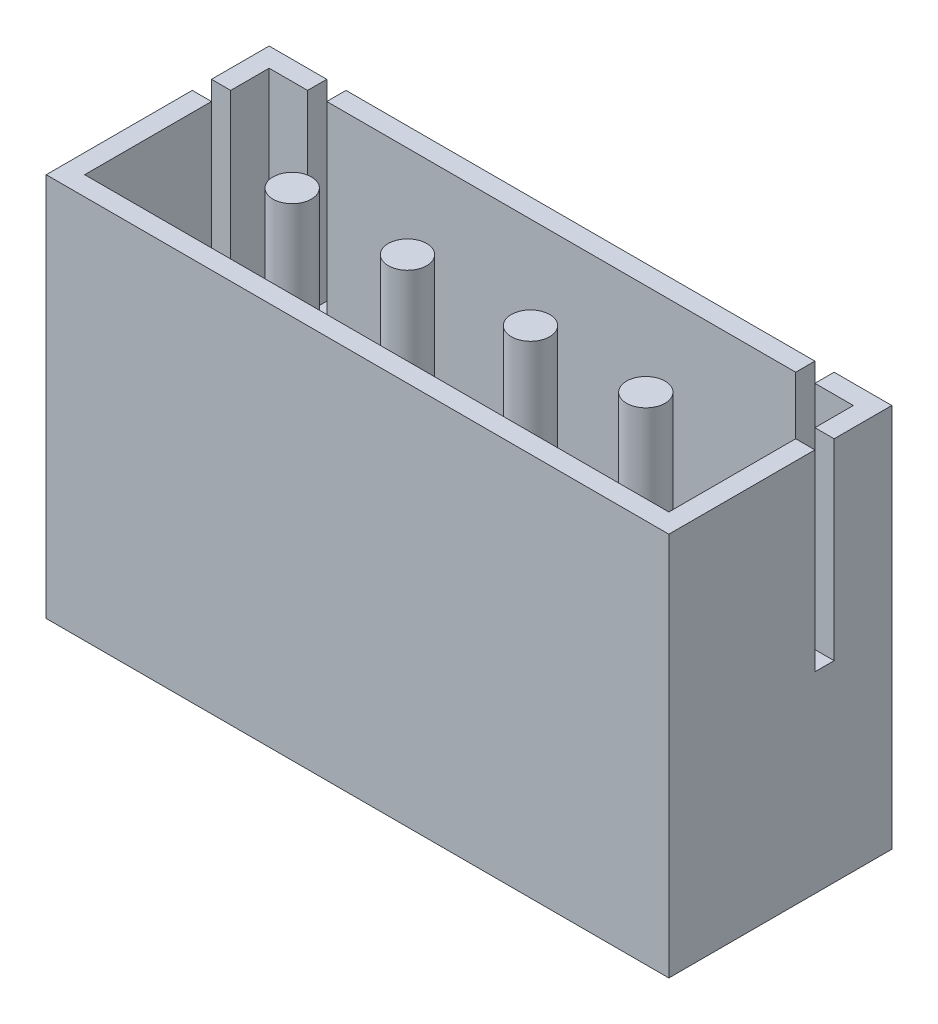
ISO-10303-21;
HEADER;
FILE_DESCRIPTION(('STEP AP214'),'2;1');
FILE_NAME('part.step','',(''),(''),'','','');
FILE_SCHEMA(('AUTOMOTIVE_DESIGN { 1 0 10303 214 1 1 1 1 }'));
ENDSEC;
DATA;
#1=APPLICATION_CONTEXT('core data for automotive mechanical design processes');
#2=APPLICATION_PROTOCOL_DEFINITION('international standard','automotive_design',2000,#1);
#3=PRODUCT_CONTEXT('',#1,'mechanical');
#4=PRODUCT('Part','Part','',(#3));
#5=PRODUCT_RELATED_PRODUCT_CATEGORY('part','',(#4));
#6=PRODUCT_DEFINITION_FORMATION('','',#4);
#7=PRODUCT_DEFINITION_CONTEXT('part definition',#1,'design');
#8=PRODUCT_DEFINITION('design','',#6,#7);
#9=PRODUCT_DEFINITION_SHAPE('','',#8);
#10=(LENGTH_UNIT() NAMED_UNIT(*) SI_UNIT(.MILLI.,.METRE.));
#11=(NAMED_UNIT(*) PLANE_ANGLE_UNIT() SI_UNIT($,.RADIAN.));
#12=(NAMED_UNIT(*) SI_UNIT($,.STERADIAN.) SOLID_ANGLE_UNIT());
#13=UNCERTAINTY_MEASURE_WITH_UNIT(LENGTH_MEASURE(1.E-05),#10,'distance_accuracy_value','');
#14=(GEOMETRIC_REPRESENTATION_CONTEXT(3) GLOBAL_UNCERTAINTY_ASSIGNED_CONTEXT((#13)) GLOBAL_UNIT_ASSIGNED_CONTEXT((#10,
#11,#12)) REPRESENTATION_CONTEXT('',''));
#15=CARTESIAN_POINT('',(0.,0.,0.));
#16=DIRECTION('',(0.,0.,1.));
#17=DIRECTION('',(1.,0.,0.));
#18=AXIS2_PLACEMENT_3D('',#15,#16,#17);
#19=CARTESIAN_POINT('',(8.1,10.,2.9));
#20=DIRECTION('',(-1.,0.,0.));
#21=DIRECTION('',(0.,0.,1.));
#22=AXIS2_PLACEMENT_3D('',#19,#20,#21);
#23=PLANE('',#22);
#24=DIRECTION('',(0.,1.,0.));
#25=VECTOR('',#24,1.);
#26=CARTESIAN_POINT('',(8.1,5.,-0.900000000000001));
#27=LINE('',#26,#25);
#28=CARTESIAN_POINT('',(8.1,5.,-0.900000000000001));
#29=VERTEX_POINT('',#28);
#30=CARTESIAN_POINT('',(8.1,10.,-0.900000000000001));
#31=VERTEX_POINT('',#30);
#32=EDGE_CURVE('E262',#29,#31,#27,.T.);
#33=ORIENTED_EDGE('',*,*,#32,.T.);
#34=DIRECTION('',(0.,0.,-1.));
#35=VECTOR('',#34,1.);
#36=CARTESIAN_POINT('',(8.1,10.,2.9));
#37=LINE('',#36,#35);
#38=CARTESIAN_POINT('',(8.1,10.,2.9));
#39=VERTEX_POINT('',#38);
#40=EDGE_CURVE('E436',#39,#31,#37,.T.);
#41=ORIENTED_EDGE('',*,*,#40,.F.);
#42=DIRECTION('',(0.,-1.,0.));
#43=VECTOR('',#42,1.);
#44=CARTESIAN_POINT('',(8.1,10.,2.9));
#45=LINE('',#44,#43);
#46=CARTESIAN_POINT('',(8.1,0.,2.9));
#47=VERTEX_POINT('',#46);
#48=EDGE_CURVE('E51',#39,#47,#45,.T.);
#49=ORIENTED_EDGE('',*,*,#48,.T.);
#50=DIRECTION('',(0.,0.,-1.));
#51=VECTOR('',#50,1.);
#52=CARTESIAN_POINT('',(8.1,0.,2.9));
#53=LINE('',#52,#51);
#54=CARTESIAN_POINT('',(8.1,0.,-2.9));
#55=VERTEX_POINT('',#54);
#56=EDGE_CURVE('E453',#47,#55,#53,.T.);
#57=ORIENTED_EDGE('',*,*,#56,.T.);
#58=DIRECTION('',(0.,-1.,0.));
#59=VECTOR('',#58,1.);
#60=CARTESIAN_POINT('',(8.1,10.,-2.9));
#61=LINE('',#60,#59);
#62=CARTESIAN_POINT('',(8.1,10.,-2.9));
#63=VERTEX_POINT('',#62);
#64=EDGE_CURVE('E462',#63,#55,#61,.T.);
#65=ORIENTED_EDGE('',*,*,#64,.F.);
#66=CARTESIAN_POINT('',(8.1,10.,-1.4));
#67=VERTEX_POINT('',#66);
#68=EDGE_CURVE('E435',#67,#63,#37,.T.);
#69=ORIENTED_EDGE('',*,*,#68,.F.);
#70=DIRECTION('',(0.,1.,0.));
#71=VECTOR('',#70,1.);
#72=CARTESIAN_POINT('',(8.1,5.,-1.4));
#73=LINE('',#72,#71);
#74=CARTESIAN_POINT('',(8.1,5.,-1.4));
#75=VERTEX_POINT('',#74);
#76=EDGE_CURVE('E254',#75,#67,#73,.T.);
#77=ORIENTED_EDGE('',*,*,#76,.F.);
#78=DIRECTION('',(0.,0.,1.));
#79=VECTOR('',#78,1.);
#80=CARTESIAN_POINT('',(8.1,5.,-1.4));
#81=LINE('',#80,#79);
#82=EDGE_CURVE('E240',#75,#29,#81,.T.);
#83=ORIENTED_EDGE('',*,*,#82,.T.);
#84=EDGE_LOOP('',(#33,#41,#49,#57,#65,#69,#77,#83));
#85=FACE_BOUND('',#84,.T.);
#86=ADVANCED_FACE('F42',(#85),#23,.F.);
#87=CARTESIAN_POINT('',(8.1,10.,-2.9));
#88=DIRECTION('',(0.,0.,1.));
#89=DIRECTION('',(1.,0.,0.));
#90=AXIS2_PLACEMENT_3D('',#87,#88,#89);
#91=PLANE('',#90);
#92=DIRECTION('',(0.,1.,0.));
#93=VECTOR('',#92,1.);
#94=CARTESIAN_POINT('',(6.1,5.,-2.9));
#95=LINE('',#94,#93);
#96=CARTESIAN_POINT('',(6.1,5.,-2.9));
#97=VERTEX_POINT('',#96);
#98=CARTESIAN_POINT('',(6.1,10.,-2.9));
#99=VERTEX_POINT('',#98);
#100=EDGE_CURVE('E235',#97,#99,#95,.T.);
#101=ORIENTED_EDGE('',*,*,#100,.F.);
#102=DIRECTION('',(1.,0.,0.));
#103=VECTOR('',#102,1.);
#104=CARTESIAN_POINT('',(6.6,5.,-2.9));
#105=LINE('',#104,#103);
#106=CARTESIAN_POINT('',(6.6,5.,-2.9));
#107=VERTEX_POINT('',#106);
#108=EDGE_CURVE('E216',#97,#107,#105,.T.);
#109=ORIENTED_EDGE('',*,*,#108,.T.);
#110=DIRECTION('',(0.,1.,0.));
#111=VECTOR('',#110,1.);
#112=CARTESIAN_POINT('',(6.6,5.,-2.9));
#113=LINE('',#112,#111);
#114=CARTESIAN_POINT('',(6.6,10.,-2.9));
#115=VERTEX_POINT('',#114);
#116=EDGE_CURVE('E211',#107,#115,#113,.T.);
#117=ORIENTED_EDGE('',*,*,#116,.T.);
#118=DIRECTION('',(-1.,0.,0.));
#119=VECTOR('',#118,1.);
#120=CARTESIAN_POINT('',(8.1,10.,-2.9));
#121=LINE('',#120,#119);
#122=EDGE_CURVE('E441',#63,#115,#121,.T.);
#123=ORIENTED_EDGE('',*,*,#122,.F.);
#124=ORIENTED_EDGE('',*,*,#64,.T.);
#125=DIRECTION('',(-1.,0.,0.));
#126=VECTOR('',#125,1.);
#127=CARTESIAN_POINT('',(8.1,0.,-2.9));
#128=LINE('',#127,#126);
#129=CARTESIAN_POINT('',(-8.1,0.,-2.9));
#130=VERTEX_POINT('',#129);
#131=EDGE_CURVE('E456',#55,#130,#128,.T.);
#132=ORIENTED_EDGE('',*,*,#131,.T.);
#133=DIRECTION('',(0.,-1.,0.));
#134=VECTOR('',#133,1.);
#135=CARTESIAN_POINT('',(-8.1,10.,-2.9));
#136=LINE('',#135,#134);
#137=CARTESIAN_POINT('',(-8.1,10.,-2.9));
#138=VERTEX_POINT('',#137);
#139=EDGE_CURVE('E445',#138,#130,#136,.T.);
#140=ORIENTED_EDGE('',*,*,#139,.F.);
#141=CARTESIAN_POINT('',(-6.6,10.,-2.9));
#142=VERTEX_POINT('',#141);
#143=EDGE_CURVE('E440',#142,#138,#121,.T.);
#144=ORIENTED_EDGE('',*,*,#143,.F.);
#145=DIRECTION('',(0.,1.,0.));
#146=VECTOR('',#145,1.);
#147=CARTESIAN_POINT('',(-6.6,5.,-2.9));
#148=LINE('',#147,#146);
#149=CARTESIAN_POINT('',(-6.6,5.,-2.9));
#150=VERTEX_POINT('',#149);
#151=EDGE_CURVE('E304',#150,#142,#148,.T.);
#152=ORIENTED_EDGE('',*,*,#151,.F.);
#153=DIRECTION('',(-1.,0.,0.));
#154=VECTOR('',#153,1.);
#155=CARTESIAN_POINT('',(-6.6,5.,-2.9));
#156=LINE('',#155,#154);
#157=CARTESIAN_POINT('',(-6.1,5.,-2.9));
#158=VERTEX_POINT('',#157);
#159=EDGE_CURVE('E285',#158,#150,#156,.T.);
#160=ORIENTED_EDGE('',*,*,#159,.F.);
#161=DIRECTION('',(0.,1.,0.));
#162=VECTOR('',#161,1.);
#163=CARTESIAN_POINT('',(-6.1,5.,-2.9));
#164=LINE('',#163,#162);
#165=CARTESIAN_POINT('',(-6.1,10.,-2.9));
#166=VERTEX_POINT('',#165);
#167=EDGE_CURVE('E307',#158,#166,#164,.T.);
#168=ORIENTED_EDGE('',*,*,#167,.T.);
#169=EDGE_CURVE('E446',#99,#166,#121,.T.);
#170=ORIENTED_EDGE('',*,*,#169,.F.);
#171=EDGE_LOOP('',(#101,#109,#117,#123,#124,#132,#140,#144,#152,#160,#168,#170));
#172=FACE_BOUND('',#171,.T.);
#173=ADVANCED_FACE('F481',(#172),#91,.F.);
#174=CARTESIAN_POINT('',(0.,10.,0.));
#175=DIRECTION('',(0.,1.,0.));
#176=DIRECTION('',(0.,0.,1.));
#177=AXIS2_PLACEMENT_3D('',#174,#175,#176);
#178=PLANE('',#177);
#179=DIRECTION('',(-1.,0.,0.));
#180=VECTOR('',#179,1.);
#181=CARTESIAN_POINT('',(7.6,10.,-2.4));
#182=LINE('',#181,#180);
#183=CARTESIAN_POINT('',(6.1,10.,-2.4));
#184=VERTEX_POINT('',#183);
#185=CARTESIAN_POINT('',(-6.1,10.,-2.4));
#186=VERTEX_POINT('',#185);
#187=EDGE_CURVE('E412',#184,#186,#182,.T.);
#188=ORIENTED_EDGE('',*,*,#187,.F.);
#189=DIRECTION('',(0.,0.,-1.));
#190=VECTOR('',#189,1.);
#191=CARTESIAN_POINT('',(6.1,10.,-2.9));
#192=LINE('',#191,#190);
#193=EDGE_CURVE('E224',#184,#99,#192,.T.);
#194=ORIENTED_EDGE('',*,*,#193,.T.);
#195=ORIENTED_EDGE('',*,*,#169,.T.);
#196=DIRECTION('',(0.,0.,-1.));
#197=VECTOR('',#196,1.);
#198=CARTESIAN_POINT('',(-6.1,10.,-2.9));
#199=LINE('',#198,#197);
#200=EDGE_CURVE('E292',#186,#166,#199,.T.);
#201=ORIENTED_EDGE('',*,*,#200,.F.);
#202=EDGE_LOOP('',(#188,#194,#195,#201));
#203=FACE_BOUND('',#202,.T.);
#204=ADVANCED_FACE('F502',(#203),#178,.T.);
#205=ORIENTED_EDGE('',*,*,#122,.T.);
#206=DIRECTION('',(0.,0.,1.));
#207=VECTOR('',#206,1.);
#208=CARTESIAN_POINT('',(6.6,10.,-2.4));
#209=LINE('',#208,#207);
#210=CARTESIAN_POINT('',(6.6,10.,-2.4));
#211=VERTEX_POINT('',#210);
#212=EDGE_CURVE('E266',#115,#211,#209,.T.);
#213=ORIENTED_EDGE('',*,*,#212,.T.);
#214=CARTESIAN_POINT('',(7.6,10.,-2.4));
#215=VERTEX_POINT('',#214);
#216=EDGE_CURVE('E230',#215,#211,#182,.T.);
#217=ORIENTED_EDGE('',*,*,#216,.F.);
#218=DIRECTION('',(0.,0.,-1.));
#219=VECTOR('',#218,1.);
#220=CARTESIAN_POINT('',(7.6,10.,2.4));
#221=LINE('',#220,#219);
#222=CARTESIAN_POINT('',(7.6,10.,-1.4));
#223=VERTEX_POINT('',#222);
#224=EDGE_CURVE('E404',#223,#215,#221,.T.);
#225=ORIENTED_EDGE('',*,*,#224,.F.);
#226=DIRECTION('',(1.,0.,0.));
#227=VECTOR('',#226,1.);
#228=CARTESIAN_POINT('',(7.6,10.,-1.4));
#229=LINE('',#228,#227);
#230=EDGE_CURVE('E255',#223,#67,#229,.T.);
#231=ORIENTED_EDGE('',*,*,#230,.T.);
#232=ORIENTED_EDGE('',*,*,#68,.T.);
#233=EDGE_LOOP('',(#205,#213,#217,#225,#231,#232));
#234=FACE_BOUND('',#233,.T.);
#235=ADVANCED_FACE('F528',(#234),#178,.T.);
#236=ORIENTED_EDGE('',*,*,#40,.T.);
#237=DIRECTION('',(-1.,0.,0.));
#238=VECTOR('',#237,1.);
#239=CARTESIAN_POINT('',(8.1,10.,-0.900000000000001));
#240=LINE('',#239,#238);
#241=CARTESIAN_POINT('',(7.6,10.,-0.9));
#242=VERTEX_POINT('',#241);
#243=EDGE_CURVE('E244',#31,#242,#240,.T.);
#244=ORIENTED_EDGE('',*,*,#243,.T.);
#245=CARTESIAN_POINT('',(7.6,10.,2.4));
#246=VERTEX_POINT('',#245);
#247=EDGE_CURVE('E405',#246,#242,#221,.T.);
#248=ORIENTED_EDGE('',*,*,#247,.F.);
#249=DIRECTION('',(1.,0.,0.));
#250=VECTOR('',#249,1.);
#251=CARTESIAN_POINT('',(7.6,10.,2.4));
#252=LINE('',#251,#250);
#253=CARTESIAN_POINT('',(-7.6,10.,2.4));
#254=VERTEX_POINT('',#253);
#255=EDGE_CURVE('E400',#254,#246,#252,.T.);
#256=ORIENTED_EDGE('',*,*,#255,.F.);
#257=DIRECTION('',(0.,0.,1.));
#258=VECTOR('',#257,1.);
#259=CARTESIAN_POINT('',(-7.6,10.,2.4));
#260=LINE('',#259,#258);
#261=CARTESIAN_POINT('',(-7.6,10.,-0.9));
#262=VERTEX_POINT('',#261);
#263=EDGE_CURVE('E375',#262,#254,#260,.T.);
#264=ORIENTED_EDGE('',*,*,#263,.F.);
#265=DIRECTION('',(1.,0.,0.));
#266=VECTOR('',#265,1.);
#267=CARTESIAN_POINT('',(-8.1,10.,-0.900000000000001));
#268=LINE('',#267,#266);
#269=CARTESIAN_POINT('',(-8.1,10.,-0.900000000000001));
#270=VERTEX_POINT('',#269);
#271=EDGE_CURVE('E296',#270,#262,#268,.T.);
#272=ORIENTED_EDGE('',*,*,#271,.F.);
#273=DIRECTION('',(0.,0.,1.));
#274=VECTOR('',#273,1.);
#275=CARTESIAN_POINT('',(-8.1,10.,2.9));
#276=LINE('',#275,#274);
#277=CARTESIAN_POINT('',(-8.1,10.,2.9));
#278=VERTEX_POINT('',#277);
#279=EDGE_CURVE('E432',#270,#278,#276,.T.);
#280=ORIENTED_EDGE('',*,*,#279,.T.);
#281=DIRECTION('',(1.,0.,0.));
#282=VECTOR('',#281,1.);
#283=CARTESIAN_POINT('',(8.1,10.,2.9));
#284=LINE('',#283,#282);
#285=EDGE_CURVE('E431',#278,#39,#284,.T.);
#286=ORIENTED_EDGE('',*,*,#285,.T.);
#287=EDGE_LOOP('',(#236,#244,#248,#256,#264,#272,#280,#286));
#288=FACE_BOUND('',#287,.T.);
#289=ADVANCED_FACE('F578',(#288),#178,.T.);
#290=CARTESIAN_POINT('',(7.6,4.,-2.4));
#291=DIRECTION('',(0.,0.,-1.));
#292=DIRECTION('',(-1.,0.,0.));
#293=AXIS2_PLACEMENT_3D('',#290,#291,#292);
#294=PLANE('',#293);
#295=DIRECTION('',(0.,1.,0.));
#296=VECTOR('',#295,1.);
#297=CARTESIAN_POINT('',(6.1,5.,-2.4));
#298=LINE('',#297,#296);
#299=CARTESIAN_POINT('',(6.1,5.,-2.4));
#300=VERTEX_POINT('',#299);
#301=EDGE_CURVE('E58',#300,#184,#298,.T.);
#302=ORIENTED_EDGE('',*,*,#301,.T.);
#303=ORIENTED_EDGE('',*,*,#187,.T.);
#304=DIRECTION('',(0.,1.,0.));
#305=VECTOR('',#304,1.);
#306=CARTESIAN_POINT('',(-6.1,5.,-2.4));
#307=LINE('',#306,#305);
#308=CARTESIAN_POINT('',(-6.1,5.,-2.4));
#309=VERTEX_POINT('',#308);
#310=EDGE_CURVE('E291',#309,#186,#307,.T.);
#311=ORIENTED_EDGE('',*,*,#310,.F.);
#312=DIRECTION('',(1.,0.,0.));
#313=VECTOR('',#312,1.);
#314=CARTESIAN_POINT('',(-6.1,5.,-2.4));
#315=LINE('',#314,#313);
#316=CARTESIAN_POINT('',(-6.6,5.,-2.4));
#317=VERTEX_POINT('',#316);
#318=EDGE_CURVE('E276',#317,#309,#315,.T.);
#319=ORIENTED_EDGE('',*,*,#318,.F.);
#320=DIRECTION('',(0.,1.,0.));
#321=VECTOR('',#320,1.);
#322=CARTESIAN_POINT('',(-6.6,5.,-2.4));
#323=LINE('',#322,#321);
#324=CARTESIAN_POINT('',(-6.6,10.,-2.4));
#325=VERTEX_POINT('',#324);
#326=EDGE_CURVE('E299',#317,#325,#323,.T.);
#327=ORIENTED_EDGE('',*,*,#326,.T.);
#328=CARTESIAN_POINT('',(-7.6,10.,-2.4));
#329=VERTEX_POINT('',#328);
#330=EDGE_CURVE('E409',#325,#329,#182,.T.);
#331=ORIENTED_EDGE('',*,*,#330,.T.);
#332=DIRECTION('',(0.,1.,0.));
#333=VECTOR('',#332,1.);
#334=CARTESIAN_POINT('',(-7.6,4.,-2.4));
#335=LINE('',#334,#333);
#336=CARTESIAN_POINT('',(-7.6,4.,-2.4));
#337=VERTEX_POINT('',#336);
#338=EDGE_CURVE('E413',#337,#329,#335,.T.);
#339=ORIENTED_EDGE('',*,*,#338,.F.);
#340=DIRECTION('',(-1.,0.,0.));
#341=VECTOR('',#340,1.);
#342=CARTESIAN_POINT('',(7.6,4.,-2.4));
#343=LINE('',#342,#341);
#344=CARTESIAN_POINT('',(7.6,4.,-2.4));
#345=VERTEX_POINT('',#344);
#346=EDGE_CURVE('E391',#345,#337,#343,.T.);
#347=ORIENTED_EDGE('',*,*,#346,.F.);
#348=DIRECTION('',(0.,1.,0.));
#349=VECTOR('',#348,1.);
#350=CARTESIAN_POINT('',(7.6,4.,-2.4));
#351=LINE('',#350,#349);
#352=EDGE_CURVE('E418',#345,#215,#351,.T.);
#353=ORIENTED_EDGE('',*,*,#352,.T.);
#354=ORIENTED_EDGE('',*,*,#216,.T.);
#355=DIRECTION('',(0.,1.,0.));
#356=VECTOR('',#355,1.);
#357=CARTESIAN_POINT('',(6.6,5.,-2.4));
#358=LINE('',#357,#356);
#359=CARTESIAN_POINT('',(6.6,5.,-2.4));
#360=VERTEX_POINT('',#359);
#361=EDGE_CURVE('E208',#360,#211,#358,.T.);
#362=ORIENTED_EDGE('',*,*,#361,.F.);
#363=DIRECTION('',(-1.,0.,0.));
#364=VECTOR('',#363,1.);
#365=CARTESIAN_POINT('',(6.1,5.,-2.4));
#366=LINE('',#365,#364);
#367=EDGE_CURVE('E217',#360,#300,#366,.T.);
#368=ORIENTED_EDGE('',*,*,#367,.T.);
#369=EDGE_LOOP('',(#302,#303,#311,#319,#327,#331,#339,#347,#353,#354,#362,#368));
#370=FACE_BOUND('',#369,.T.);
#371=ADVANCED_FACE('F227',(#370),#294,.F.);
#372=CARTESIAN_POINT('',(7.6,4.,2.4));
#373=DIRECTION('',(1.,0.,0.));
#374=DIRECTION('',(0.,0.,-1.));
#375=AXIS2_PLACEMENT_3D('',#372,#373,#374);
#376=PLANE('',#375);
#377=DIRECTION('',(0.,1.,0.));
#378=VECTOR('',#377,1.);
#379=CARTESIAN_POINT('',(7.6,5.,-0.9));
#380=LINE('',#379,#378);
#381=CARTESIAN_POINT('',(7.6,5.,-0.9));
#382=VERTEX_POINT('',#381);
#383=EDGE_CURVE('E267',#382,#242,#380,.T.);
#384=ORIENTED_EDGE('',*,*,#383,.F.);
#385=DIRECTION('',(0.,0.,-1.));
#386=VECTOR('',#385,1.);
#387=CARTESIAN_POINT('',(7.6,5.,-0.9));
#388=LINE('',#387,#386);
#389=CARTESIAN_POINT('',(7.6,5.,-1.4));
#390=VERTEX_POINT('',#389);
#391=EDGE_CURVE('E247',#382,#390,#388,.T.);
#392=ORIENTED_EDGE('',*,*,#391,.T.);
#393=DIRECTION('',(0.,1.,0.));
#394=VECTOR('',#393,1.);
#395=CARTESIAN_POINT('',(7.6,5.,-1.4));
#396=LINE('',#395,#394);
#397=EDGE_CURVE('E270',#390,#223,#396,.T.);
#398=ORIENTED_EDGE('',*,*,#397,.T.);
#399=ORIENTED_EDGE('',*,*,#224,.T.);
#400=ORIENTED_EDGE('',*,*,#352,.F.);
#401=DIRECTION('',(0.,0.,-1.));
#402=VECTOR('',#401,1.);
#403=CARTESIAN_POINT('',(7.6,4.,2.4));
#404=LINE('',#403,#402);
#405=CARTESIAN_POINT('',(7.6,4.,2.4));
#406=VERTEX_POINT('',#405);
#407=EDGE_CURVE('E387',#406,#345,#404,.T.);
#408=ORIENTED_EDGE('',*,*,#407,.F.);
#409=DIRECTION('',(0.,1.,0.));
#410=VECTOR('',#409,1.);
#411=CARTESIAN_POINT('',(7.6,4.,2.4));
#412=LINE('',#411,#410);
#413=EDGE_CURVE('E421',#406,#246,#412,.T.);
#414=ORIENTED_EDGE('',*,*,#413,.T.);
#415=ORIENTED_EDGE('',*,*,#247,.T.);
#416=EDGE_LOOP('',(#384,#392,#398,#399,#400,#408,#414,#415));
#417=FACE_BOUND('',#416,.T.);
#418=ADVANCED_FACE('F581',(#417),#376,.F.);
#419=DIRECTION('',(0.,0.,1.));
#420=VECTOR('',#419,1.);
#421=CARTESIAN_POINT('',(-6.6,10.,-2.4));
#422=LINE('',#421,#420);
#423=EDGE_CURVE('E281',#142,#325,#422,.T.);
#424=ORIENTED_EDGE('',*,*,#423,.F.);
#425=ORIENTED_EDGE('',*,*,#143,.T.);
#426=CARTESIAN_POINT('',(-8.1,10.,-1.4));
#427=VERTEX_POINT('',#426);
#428=EDGE_CURVE('E427',#138,#427,#276,.T.);
#429=ORIENTED_EDGE('',*,*,#428,.T.);
#430=DIRECTION('',(-1.,0.,0.));
#431=VECTOR('',#430,1.);
#432=CARTESIAN_POINT('',(-7.6,10.,-1.4));
#433=LINE('',#432,#431);
#434=CARTESIAN_POINT('',(-7.6,10.,-1.4));
#435=VERTEX_POINT('',#434);
#436=EDGE_CURVE('E329',#435,#427,#433,.T.);
#437=ORIENTED_EDGE('',*,*,#436,.F.);
#438=EDGE_CURVE('E396',#329,#435,#260,.T.);
#439=ORIENTED_EDGE('',*,*,#438,.F.);
#440=ORIENTED_EDGE('',*,*,#330,.F.);
#441=EDGE_LOOP('',(#424,#425,#429,#437,#439,#440));
#442=FACE_BOUND('',#441,.T.);
#443=ADVANCED_FACE('F491',(#442),#178,.T.);
#444=CARTESIAN_POINT('',(-8.1,10.,2.9));
#445=DIRECTION('',(1.,0.,0.));
#446=DIRECTION('',(0.,0.,-1.));
#447=AXIS2_PLACEMENT_3D('',#444,#445,#446);
#448=PLANE('',#447);
#449=DIRECTION('',(0.,0.,1.));
#450=VECTOR('',#449,1.);
#451=CARTESIAN_POINT('',(-8.1,5.,-1.4));
#452=LINE('',#451,#450);
#453=CARTESIAN_POINT('',(-8.1,5.,-1.4));
#454=VERTEX_POINT('',#453);
#455=CARTESIAN_POINT('',(-8.1,5.,-0.900000000000001));
#456=VERTEX_POINT('',#455);
#457=EDGE_CURVE('E332',#454,#456,#452,.T.);
#458=ORIENTED_EDGE('',*,*,#457,.F.);
#459=DIRECTION('',(0.,1.,0.));
#460=VECTOR('',#459,1.);
#461=CARTESIAN_POINT('',(-8.1,5.,-1.4));
#462=LINE('',#461,#460);
#463=EDGE_CURVE('E325',#454,#427,#462,.T.);
#464=ORIENTED_EDGE('',*,*,#463,.T.);
#465=ORIENTED_EDGE('',*,*,#428,.F.);
#466=ORIENTED_EDGE('',*,*,#139,.T.);
#467=DIRECTION('',(0.,0.,1.));
#468=VECTOR('',#467,1.);
#469=CARTESIAN_POINT('',(-8.1,0.,2.9));
#470=LINE('',#469,#468);
#471=CARTESIAN_POINT('',(-8.1,0.,2.9));
#472=VERTEX_POINT('',#471);
#473=EDGE_CURVE('E417',#130,#472,#470,.T.);
#474=ORIENTED_EDGE('',*,*,#473,.T.);
#475=DIRECTION('',(0.,-1.,0.));
#476=VECTOR('',#475,1.);
#477=CARTESIAN_POINT('',(-8.1,10.,2.9));
#478=LINE('',#477,#476);
#479=EDGE_CURVE('E11',#278,#472,#478,.T.);
#480=ORIENTED_EDGE('',*,*,#479,.F.);
#481=ORIENTED_EDGE('',*,*,#279,.F.);
#482=DIRECTION('',(0.,1.,0.));
#483=VECTOR('',#482,1.);
#484=CARTESIAN_POINT('',(-8.1,5.,-0.900000000000001));
#485=LINE('',#484,#483);
#486=EDGE_CURVE('E314',#456,#270,#485,.T.);
#487=ORIENTED_EDGE('',*,*,#486,.F.);
#488=EDGE_LOOP('',(#458,#464,#465,#466,#474,#480,#481,#487));
#489=FACE_BOUND('',#488,.T.);
#490=ADVANCED_FACE('F44',(#489),#448,.F.);
#491=CARTESIAN_POINT('',(8.1,10.,2.9));
#492=DIRECTION('',(0.,0.,-1.));
#493=DIRECTION('',(-1.,0.,0.));
#494=AXIS2_PLACEMENT_3D('',#491,#492,#493);
#495=PLANE('',#494);
#496=DIRECTION('',(1.,0.,0.));
#497=VECTOR('',#496,1.);
#498=CARTESIAN_POINT('',(8.1,0.,2.9));
#499=LINE('',#498,#497);
#500=EDGE_CURVE('E450',#472,#47,#499,.T.);
#501=ORIENTED_EDGE('',*,*,#500,.T.);
#502=ORIENTED_EDGE('',*,*,#48,.F.);
#503=ORIENTED_EDGE('',*,*,#285,.F.);
#504=ORIENTED_EDGE('',*,*,#479,.T.);
#505=EDGE_LOOP('',(#501,#502,#503,#504));
#506=FACE_BOUND('',#505,.T.);
#507=ADVANCED_FACE('F558',(#506),#495,.F.);
#508=CARTESIAN_POINT('',(0.,0.,0.));
#509=DIRECTION('',(0.,1.,0.));
#510=DIRECTION('',(0.,0.,1.));
#511=AXIS2_PLACEMENT_3D('',#508,#509,#510);
#512=PLANE('',#511);
#513=ORIENTED_EDGE('',*,*,#473,.F.);
#514=ORIENTED_EDGE('',*,*,#131,.F.);
#515=ORIENTED_EDGE('',*,*,#56,.F.);
#516=ORIENTED_EDGE('',*,*,#500,.F.);
#517=EDGE_LOOP('',(#513,#514,#515,#516));
#518=FACE_BOUND('',#517,.T.);
#519=ADVANCED_FACE('F477',(#518),#512,.F.);
#520=CARTESIAN_POINT('',(-7.6,4.,2.4));
#521=DIRECTION('',(-1.,0.,0.));
#522=DIRECTION('',(0.,0.,1.));
#523=AXIS2_PLACEMENT_3D('',#520,#521,#522);
#524=PLANE('',#523);
#525=ORIENTED_EDGE('',*,*,#438,.T.);
#526=DIRECTION('',(0.,1.,0.));
#527=VECTOR('',#526,1.);
#528=CARTESIAN_POINT('',(-7.6,5.,-1.4));
#529=LINE('',#528,#527);
#530=CARTESIAN_POINT('',(-7.6,5.,-1.4));
#531=VERTEX_POINT('',#530);
#532=EDGE_CURVE('E322',#531,#435,#529,.T.);
#533=ORIENTED_EDGE('',*,*,#532,.F.);
#534=DIRECTION('',(0.,0.,-1.));
#535=VECTOR('',#534,1.);
#536=CARTESIAN_POINT('',(-7.6,5.,-0.9));
#537=LINE('',#536,#535);
#538=CARTESIAN_POINT('',(-7.6,5.,-0.900000000000001));
#539=VERTEX_POINT('',#538);
#540=EDGE_CURVE('E338',#539,#531,#537,.T.);
#541=ORIENTED_EDGE('',*,*,#540,.F.);
#542=DIRECTION('',(0.,1.,0.));
#543=VECTOR('',#542,1.);
#544=CARTESIAN_POINT('',(-7.6,5.,-0.9));
#545=LINE('',#544,#543);
#546=EDGE_CURVE('E318',#539,#262,#545,.T.);
#547=ORIENTED_EDGE('',*,*,#546,.T.);
#548=ORIENTED_EDGE('',*,*,#263,.T.);
#549=DIRECTION('',(0.,1.,0.));
#550=VECTOR('',#549,1.);
#551=CARTESIAN_POINT('',(-7.6,4.,2.4));
#552=LINE('',#551,#550);
#553=CARTESIAN_POINT('',(-7.6,4.,2.4));
#554=VERTEX_POINT('',#553);
#555=EDGE_CURVE('E395',#554,#254,#552,.T.);
#556=ORIENTED_EDGE('',*,*,#555,.F.);
#557=DIRECTION('',(0.,0.,1.));
#558=VECTOR('',#557,1.);
#559=CARTESIAN_POINT('',(-7.6,4.,2.4));
#560=LINE('',#559,#558);
#561=EDGE_CURVE('E379',#337,#554,#560,.T.);
#562=ORIENTED_EDGE('',*,*,#561,.F.);
#563=ORIENTED_EDGE('',*,*,#338,.T.);
#564=EDGE_LOOP('',(#525,#533,#541,#547,#548,#556,#562,#563));
#565=FACE_BOUND('',#564,.T.);
#566=ADVANCED_FACE('F519',(#565),#524,.F.);
#567=CARTESIAN_POINT('',(7.6,4.,2.4));
#568=DIRECTION('',(0.,0.,1.));
#569=DIRECTION('',(1.,0.,0.));
#570=AXIS2_PLACEMENT_3D('',#567,#568,#569);
#571=PLANE('',#570);
#572=ORIENTED_EDGE('',*,*,#255,.T.);
#573=ORIENTED_EDGE('',*,*,#413,.F.);
#574=DIRECTION('',(1.,0.,0.));
#575=VECTOR('',#574,1.);
#576=CARTESIAN_POINT('',(7.6,4.,2.4));
#577=LINE('',#576,#575);
#578=EDGE_CURVE('E383',#554,#406,#577,.T.);
#579=ORIENTED_EDGE('',*,*,#578,.F.);
#580=ORIENTED_EDGE('',*,*,#555,.T.);
#581=EDGE_LOOP('',(#572,#573,#579,#580));
#582=FACE_BOUND('',#581,.T.);
#583=ADVANCED_FACE('F583',(#582),#571,.F.);
#584=CARTESIAN_POINT('',(0.,4.,0.));
#585=DIRECTION('',(0.,1.,0.));
#586=DIRECTION('',(0.,0.,1.));
#587=AXIS2_PLACEMENT_3D('',#584,#585,#586);
#588=PLANE('',#587);
#589=CARTESIAN_POINT('',(4.6,4.,0.));
#590=DIRECTION('',(0.,1.,0.));
#591=DIRECTION('',(0.,0.,1.));
#592=AXIS2_PLACEMENT_3D('',#589,#590,#591);
#593=CIRCLE('',#592,0.500000000000001);
#594=CARTESIAN_POINT('',(4.6,4.,0.500000000000001));
#595=VERTEX_POINT('',#594);
#596=EDGE_CURVE('E347',#595,#595,#593,.T.);
#597=ORIENTED_EDGE('',*,*,#596,.F.);
#598=EDGE_LOOP('',(#597));
#599=FACE_BOUND('',#598,.T.);
#600=CARTESIAN_POINT('',(1.6,4.,0.));
#601=DIRECTION('',(0.,1.,0.));
#602=DIRECTION('',(0.,0.,1.));
#603=AXIS2_PLACEMENT_3D('',#600,#601,#602);
#604=CIRCLE('',#603,0.5);
#605=CARTESIAN_POINT('',(1.6,4.,0.5));
#606=VERTEX_POINT('',#605);
#607=EDGE_CURVE('E355',#606,#606,#604,.T.);
#608=ORIENTED_EDGE('',*,*,#607,.F.);
#609=EDGE_LOOP('',(#608));
#610=FACE_BOUND('',#609,.T.);
#611=CARTESIAN_POINT('',(-1.6,4.,0.));
#612=DIRECTION('',(0.,1.,0.));
#613=DIRECTION('',(0.,0.,1.));
#614=AXIS2_PLACEMENT_3D('',#611,#612,#613);
#615=CIRCLE('',#614,0.5);
#616=CARTESIAN_POINT('',(-1.6,4.,0.5));
#617=VERTEX_POINT('',#616);
#618=EDGE_CURVE('E363',#617,#617,#615,.T.);
#619=ORIENTED_EDGE('',*,*,#618,.F.);
#620=EDGE_LOOP('',(#619));
#621=FACE_BOUND('',#620,.T.);
#622=CARTESIAN_POINT('',(-4.6,4.,0.));
#623=DIRECTION('',(0.,1.,0.));
#624=DIRECTION('',(0.,0.,1.));
#625=AXIS2_PLACEMENT_3D('',#622,#623,#624);
#626=CIRCLE('',#625,0.500000000000001);
#627=CARTESIAN_POINT('',(-4.6,4.,0.500000000000001));
#628=VERTEX_POINT('',#627);
#629=EDGE_CURVE('E367',#628,#628,#626,.T.);
#630=ORIENTED_EDGE('',*,*,#629,.F.);
#631=EDGE_LOOP('',(#630));
#632=FACE_BOUND('',#631,.T.);
#633=ORIENTED_EDGE('',*,*,#561,.T.);
#634=ORIENTED_EDGE('',*,*,#578,.T.);
#635=ORIENTED_EDGE('',*,*,#407,.T.);
#636=ORIENTED_EDGE('',*,*,#346,.T.);
#637=EDGE_LOOP('',(#633,#634,#635,#636));
#638=FACE_BOUND('',#637,.T.);
#639=ADVANCED_FACE('F523',(#599,#610,#621,#632,#638),#588,.T.);
#640=CARTESIAN_POINT('',(-4.6,10.,0.));
#641=DIRECTION('',(0.,-1.,0.));
#642=DIRECTION('',(0.,0.,-1.));
#643=AXIS2_PLACEMENT_3D('',#640,#641,#642);
#644=CYLINDRICAL_SURFACE('',#643,0.500000000000001);
#645=CARTESIAN_POINT('',(-4.6,10.,0.));
#646=DIRECTION('',(0.,1.,0.));
#647=DIRECTION('',(0.,0.,1.));
#648=AXIS2_PLACEMENT_3D('',#645,#646,#647);
#649=CIRCLE('',#648,0.500000000000001);
#650=CARTESIAN_POINT('',(-4.6,10.,0.500000000000001));
#651=VERTEX_POINT('',#650);
#652=EDGE_CURVE('E371',#651,#651,#649,.T.);
#653=ORIENTED_EDGE('',*,*,#652,.F.);
#654=EDGE_LOOP('',(#653));
#655=FACE_BOUND('',#654,.T.);
#656=ORIENTED_EDGE('',*,*,#629,.T.);
#657=EDGE_LOOP('',(#656));
#658=FACE_BOUND('',#657,.T.);
#659=ADVANCED_FACE('F635',(#655,#658),#644,.T.);
#660=CARTESIAN_POINT('',(-4.6,10.,0.));
#661=DIRECTION('',(0.,1.,0.));
#662=DIRECTION('',(0.,0.,1.));
#663=AXIS2_PLACEMENT_3D('',#660,#661,#662);
#664=PLANE('',#663);
#665=ORIENTED_EDGE('',*,*,#652,.T.);
#666=EDGE_LOOP('',(#665));
#667=FACE_BOUND('',#666,.T.);
#668=ADVANCED_FACE('F628',(#667),#664,.T.);
#669=CARTESIAN_POINT('',(-1.6,10.,0.));
#670=DIRECTION('',(0.,-1.,0.));
#671=DIRECTION('',(0.,0.,-1.));
#672=AXIS2_PLACEMENT_3D('',#669,#670,#671);
#673=CYLINDRICAL_SURFACE('',#672,0.5);
#674=CARTESIAN_POINT('',(-1.6,10.,0.));
#675=DIRECTION('',(0.,1.,0.));
#676=DIRECTION('',(0.,0.,1.));
#677=AXIS2_PLACEMENT_3D('',#674,#675,#676);
#678=CIRCLE('',#677,0.5);
#679=CARTESIAN_POINT('',(-1.6,10.,0.5));
#680=VERTEX_POINT('',#679);
#681=EDGE_CURVE('E359',#680,#680,#678,.T.);
#682=ORIENTED_EDGE('',*,*,#681,.F.);
#683=EDGE_LOOP('',(#682));
#684=FACE_BOUND('',#683,.T.);
#685=ORIENTED_EDGE('',*,*,#618,.T.);
#686=EDGE_LOOP('',(#685));
#687=FACE_BOUND('',#686,.T.);
#688=ADVANCED_FACE('F625',(#684,#687),#673,.T.);
#689=CARTESIAN_POINT('',(-1.6,10.,0.));
#690=DIRECTION('',(0.,1.,0.));
#691=DIRECTION('',(0.,0.,1.));
#692=AXIS2_PLACEMENT_3D('',#689,#690,#691);
#693=PLANE('',#692);
#694=ORIENTED_EDGE('',*,*,#681,.T.);
#695=EDGE_LOOP('',(#694));
#696=FACE_BOUND('',#695,.T.);
#697=ADVANCED_FACE('F620',(#696),#693,.T.);
#698=CARTESIAN_POINT('',(1.6,10.,0.));
#699=DIRECTION('',(0.,-1.,0.));
#700=DIRECTION('',(0.,0.,-1.));
#701=AXIS2_PLACEMENT_3D('',#698,#699,#700);
#702=CYLINDRICAL_SURFACE('',#701,0.5);
#703=CARTESIAN_POINT('',(1.6,10.,0.));
#704=DIRECTION('',(0.,1.,0.));
#705=DIRECTION('',(0.,0.,1.));
#706=AXIS2_PLACEMENT_3D('',#703,#704,#705);
#707=CIRCLE('',#706,0.5);
#708=CARTESIAN_POINT('',(1.6,10.,0.5));
#709=VERTEX_POINT('',#708);
#710=EDGE_CURVE('E351',#709,#709,#707,.T.);
#711=ORIENTED_EDGE('',*,*,#710,.F.);
#712=EDGE_LOOP('',(#711));
#713=FACE_BOUND('',#712,.T.);
#714=ORIENTED_EDGE('',*,*,#607,.T.);
#715=EDGE_LOOP('',(#714));
#716=FACE_BOUND('',#715,.T.);
#717=ADVANCED_FACE('F617',(#713,#716),#702,.T.);
#718=CARTESIAN_POINT('',(1.6,10.,0.));
#719=DIRECTION('',(0.,1.,0.));
#720=DIRECTION('',(0.,0.,1.));
#721=AXIS2_PLACEMENT_3D('',#718,#719,#720);
#722=PLANE('',#721);
#723=ORIENTED_EDGE('',*,*,#710,.T.);
#724=EDGE_LOOP('',(#723));
#725=FACE_BOUND('',#724,.T.);
#726=ADVANCED_FACE('F612',(#725),#722,.T.);
#727=CARTESIAN_POINT('',(4.6,10.,0.));
#728=DIRECTION('',(0.,-1.,0.));
#729=DIRECTION('',(0.,0.,-1.));
#730=AXIS2_PLACEMENT_3D('',#727,#728,#729);
#731=CYLINDRICAL_SURFACE('',#730,0.500000000000001);
#732=CARTESIAN_POINT('',(4.6,10.,0.));
#733=DIRECTION('',(0.,1.,0.));
#734=DIRECTION('',(0.,0.,1.));
#735=AXIS2_PLACEMENT_3D('',#732,#733,#734);
#736=CIRCLE('',#735,0.500000000000001);
#737=CARTESIAN_POINT('',(4.6,10.,0.500000000000001));
#738=VERTEX_POINT('',#737);
#739=EDGE_CURVE('E303',#738,#738,#736,.T.);
#740=ORIENTED_EDGE('',*,*,#739,.F.);
#741=EDGE_LOOP('',(#740));
#742=FACE_BOUND('',#741,.T.);
#743=ORIENTED_EDGE('',*,*,#596,.T.);
#744=EDGE_LOOP('',(#743));
#745=FACE_BOUND('',#744,.T.);
#746=ADVANCED_FACE('F608',(#742,#745),#731,.T.);
#747=CARTESIAN_POINT('',(4.6,10.,0.));
#748=DIRECTION('',(0.,1.,0.));
#749=DIRECTION('',(0.,0.,1.));
#750=AXIS2_PLACEMENT_3D('',#747,#748,#749);
#751=PLANE('',#750);
#752=ORIENTED_EDGE('',*,*,#739,.T.);
#753=EDGE_LOOP('',(#752));
#754=FACE_BOUND('',#753,.T.);
#755=ADVANCED_FACE('F611',(#754),#751,.T.);
#756=CARTESIAN_POINT('',(-6.6,5.,-2.4));
#757=DIRECTION('',(-1.,0.,0.));
#758=DIRECTION('',(0.,0.,1.));
#759=AXIS2_PLACEMENT_3D('',#756,#757,#758);
#760=PLANE('',#759);
#761=ORIENTED_EDGE('',*,*,#423,.T.);
#762=ORIENTED_EDGE('',*,*,#326,.F.);
#763=DIRECTION('',(0.,0.,1.));
#764=VECTOR('',#763,1.);
#765=CARTESIAN_POINT('',(-6.6,5.,-2.4));
#766=LINE('',#765,#764);
#767=EDGE_CURVE('E288',#150,#317,#766,.T.);
#768=ORIENTED_EDGE('',*,*,#767,.F.);
#769=ORIENTED_EDGE('',*,*,#151,.T.);
#770=EDGE_LOOP('',(#761,#762,#768,#769));
#771=FACE_BOUND('',#770,.T.);
#772=ADVANCED_FACE('F512',(#771),#760,.F.);
#773=CARTESIAN_POINT('',(-6.1,5.,-2.9));
#774=DIRECTION('',(1.,0.,0.));
#775=DIRECTION('',(0.,0.,-1.));
#776=AXIS2_PLACEMENT_3D('',#773,#774,#775);
#777=PLANE('',#776);
#778=ORIENTED_EDGE('',*,*,#200,.T.);
#779=ORIENTED_EDGE('',*,*,#167,.F.);
#780=DIRECTION('',(0.,0.,-1.));
#781=VECTOR('',#780,1.);
#782=CARTESIAN_POINT('',(-6.1,5.,-2.9));
#783=LINE('',#782,#781);
#784=EDGE_CURVE('E280',#309,#158,#783,.T.);
#785=ORIENTED_EDGE('',*,*,#784,.F.);
#786=ORIENTED_EDGE('',*,*,#310,.T.);
#787=EDGE_LOOP('',(#778,#779,#785,#786));
#788=FACE_BOUND('',#787,.T.);
#789=ADVANCED_FACE('F504',(#788),#777,.F.);
#790=CARTESIAN_POINT('',(0.,5.,0.));
#791=DIRECTION('',(0.,-1.,0.));
#792=DIRECTION('',(0.,0.,-1.));
#793=AXIS2_PLACEMENT_3D('',#790,#791,#792);
#794=PLANE('',#793);
#795=ORIENTED_EDGE('',*,*,#318,.T.);
#796=ORIENTED_EDGE('',*,*,#784,.T.);
#797=ORIENTED_EDGE('',*,*,#159,.T.);
#798=ORIENTED_EDGE('',*,*,#767,.T.);
#799=EDGE_LOOP('',(#795,#796,#797,#798));
#800=FACE_BOUND('',#799,.T.);
#801=ADVANCED_FACE('F509',(#800),#794,.F.);
#802=CARTESIAN_POINT('',(-7.6,5.,-1.4));
#803=DIRECTION('',(0.,0.,-1.));
#804=DIRECTION('',(-1.,0.,0.));
#805=AXIS2_PLACEMENT_3D('',#802,#803,#804);
#806=PLANE('',#805);
#807=ORIENTED_EDGE('',*,*,#436,.T.);
#808=ORIENTED_EDGE('',*,*,#463,.F.);
#809=DIRECTION('',(-1.,0.,0.));
#810=VECTOR('',#809,1.);
#811=CARTESIAN_POINT('',(-7.6,5.,-1.4));
#812=LINE('',#811,#810);
#813=EDGE_CURVE('E317',#531,#454,#812,.T.);
#814=ORIENTED_EDGE('',*,*,#813,.F.);
#815=ORIENTED_EDGE('',*,*,#532,.T.);
#816=EDGE_LOOP('',(#807,#808,#814,#815));
#817=FACE_BOUND('',#816,.T.);
#818=ADVANCED_FACE('F595',(#817),#806,.F.);
#819=CARTESIAN_POINT('',(-8.1,5.,-0.900000000000001));
#820=DIRECTION('',(0.,0.,1.));
#821=DIRECTION('',(1.,0.,0.));
#822=AXIS2_PLACEMENT_3D('',#819,#820,#821);
#823=PLANE('',#822);
#824=ORIENTED_EDGE('',*,*,#271,.T.);
#825=ORIENTED_EDGE('',*,*,#546,.F.);
#826=DIRECTION('',(1.,0.,0.));
#827=VECTOR('',#826,1.);
#828=CARTESIAN_POINT('',(-8.1,5.,-0.900000000000001));
#829=LINE('',#828,#827);
#830=EDGE_CURVE('E341',#456,#539,#829,.T.);
#831=ORIENTED_EDGE('',*,*,#830,.F.);
#832=ORIENTED_EDGE('',*,*,#486,.T.);
#833=EDGE_LOOP('',(#824,#825,#831,#832));
#834=FACE_BOUND('',#833,.T.);
#835=ADVANCED_FACE('F590',(#834),#823,.F.);
#836=CARTESIAN_POINT('',(0.,5.,0.));
#837=DIRECTION('',(0.,1.,0.));
#838=DIRECTION('',(0.,0.,1.));
#839=AXIS2_PLACEMENT_3D('',#836,#837,#838);
#840=PLANE('',#839);
#841=ORIENTED_EDGE('',*,*,#457,.T.);
#842=ORIENTED_EDGE('',*,*,#830,.T.);
#843=ORIENTED_EDGE('',*,*,#540,.T.);
#844=ORIENTED_EDGE('',*,*,#813,.T.);
#845=EDGE_LOOP('',(#841,#842,#843,#844));
#846=FACE_BOUND('',#845,.T.);
#847=ADVANCED_FACE('F592',(#846),#840,.T.);
#848=CARTESIAN_POINT('',(8.1,5.,-0.900000000000001));
#849=DIRECTION('',(0.,0.,-1.));
#850=DIRECTION('',(-1.,0.,0.));
#851=AXIS2_PLACEMENT_3D('',#848,#849,#850);
#852=PLANE('',#851);
#853=ORIENTED_EDGE('',*,*,#243,.F.);
#854=ORIENTED_EDGE('',*,*,#32,.F.);
#855=DIRECTION('',(-1.,0.,0.));
#856=VECTOR('',#855,1.);
#857=CARTESIAN_POINT('',(8.1,5.,-0.900000000000001));
#858=LINE('',#857,#856);
#859=EDGE_CURVE('E251',#29,#382,#858,.T.);
#860=ORIENTED_EDGE('',*,*,#859,.T.);
#861=ORIENTED_EDGE('',*,*,#383,.T.);
#862=EDGE_LOOP('',(#853,#854,#860,#861));
#863=FACE_BOUND('',#862,.T.);
#864=ADVANCED_FACE('F577',(#863),#852,.T.);
#865=CARTESIAN_POINT('',(7.6,5.,-1.4));
#866=DIRECTION('',(0.,0.,1.));
#867=DIRECTION('',(1.,0.,0.));
#868=AXIS2_PLACEMENT_3D('',#865,#866,#867);
#869=PLANE('',#868);
#870=ORIENTED_EDGE('',*,*,#230,.F.);
#871=ORIENTED_EDGE('',*,*,#397,.F.);
#872=DIRECTION('',(1.,0.,0.));
#873=VECTOR('',#872,1.);
#874=CARTESIAN_POINT('',(7.6,5.,-1.4));
#875=LINE('',#874,#873);
#876=EDGE_CURVE('E66',#390,#75,#875,.T.);
#877=ORIENTED_EDGE('',*,*,#876,.T.);
#878=ORIENTED_EDGE('',*,*,#76,.T.);
#879=EDGE_LOOP('',(#870,#871,#877,#878));
#880=FACE_BOUND('',#879,.T.);
#881=ADVANCED_FACE('F547',(#880),#869,.T.);
#882=CARTESIAN_POINT('',(0.,5.,0.));
#883=DIRECTION('',(0.,1.,0.));
#884=DIRECTION('',(0.,0.,1.));
#885=AXIS2_PLACEMENT_3D('',#882,#883,#884);
#886=PLANE('',#885);
#887=ORIENTED_EDGE('',*,*,#82,.F.);
#888=ORIENTED_EDGE('',*,*,#876,.F.);
#889=ORIENTED_EDGE('',*,*,#391,.F.);
#890=ORIENTED_EDGE('',*,*,#859,.F.);
#891=EDGE_LOOP('',(#887,#888,#889,#890));
#892=FACE_BOUND('',#891,.T.);
#893=ADVANCED_FACE('F540',(#892),#886,.T.);
#894=CARTESIAN_POINT('',(6.1,5.,-2.9));
#895=DIRECTION('',(1.,0.,0.));
#896=DIRECTION('',(0.,0.,-1.));
#897=AXIS2_PLACEMENT_3D('',#894,#895,#896);
#898=PLANE('',#897);
#899=ORIENTED_EDGE('',*,*,#193,.F.);
#900=ORIENTED_EDGE('',*,*,#301,.F.);
#901=DIRECTION('',(0.,0.,-1.));
#902=VECTOR('',#901,1.);
#903=CARTESIAN_POINT('',(6.1,5.,-2.9));
#904=LINE('',#903,#902);
#905=EDGE_CURVE('E221',#300,#97,#904,.T.);
#906=ORIENTED_EDGE('',*,*,#905,.T.);
#907=ORIENTED_EDGE('',*,*,#100,.T.);
#908=EDGE_LOOP('',(#899,#900,#906,#907));
#909=FACE_BOUND('',#908,.T.);
#910=ADVANCED_FACE('F537',(#909),#898,.T.);
#911=CARTESIAN_POINT('',(6.6,5.,-2.4));
#912=DIRECTION('',(-1.,0.,0.));
#913=DIRECTION('',(0.,0.,1.));
#914=AXIS2_PLACEMENT_3D('',#911,#912,#913);
#915=PLANE('',#914);
#916=ORIENTED_EDGE('',*,*,#212,.F.);
#917=ORIENTED_EDGE('',*,*,#116,.F.);
#918=DIRECTION('',(0.,0.,1.));
#919=VECTOR('',#918,1.);
#920=CARTESIAN_POINT('',(6.6,5.,-2.4));
#921=LINE('',#920,#919);
#922=EDGE_CURVE('E204',#107,#360,#921,.T.);
#923=ORIENTED_EDGE('',*,*,#922,.T.);
#924=ORIENTED_EDGE('',*,*,#361,.T.);
#925=EDGE_LOOP('',(#916,#917,#923,#924));
#926=FACE_BOUND('',#925,.T.);
#927=ADVANCED_FACE('F206',(#926),#915,.T.);
#928=CARTESIAN_POINT('',(0.,5.,0.));
#929=DIRECTION('',(0.,-1.,0.));
#930=DIRECTION('',(0.,0.,-1.));
#931=AXIS2_PLACEMENT_3D('',#928,#929,#930);
#932=PLANE('',#931);
#933=ORIENTED_EDGE('',*,*,#367,.F.);
#934=ORIENTED_EDGE('',*,*,#922,.F.);
#935=ORIENTED_EDGE('',*,*,#108,.F.);
#936=ORIENTED_EDGE('',*,*,#905,.F.);
#937=EDGE_LOOP('',(#933,#934,#935,#936));
#938=FACE_BOUND('',#937,.T.);
#939=ADVANCED_FACE('F220',(#938),#932,.F.);
#940=CLOSED_SHELL('',(#86,#173,#204,#235,#289,#371,#418,#443,#490,#507,#519,#566,#583,#639,#659,
#668,#688,#697,#717,#726,#746,#755,#772,#789,#801,#818,#835,#847,#864,#881,#893,#910,#927,#939));
#941=MANIFOLD_SOLID_BREP('B2',#940);
#942=ADVANCED_BREP_SHAPE_REPRESENTATION('',(#18,#941),#14);
#943=SHAPE_DEFINITION_REPRESENTATION(#9,#942);
ENDSEC;
END-ISO-10303-21;
